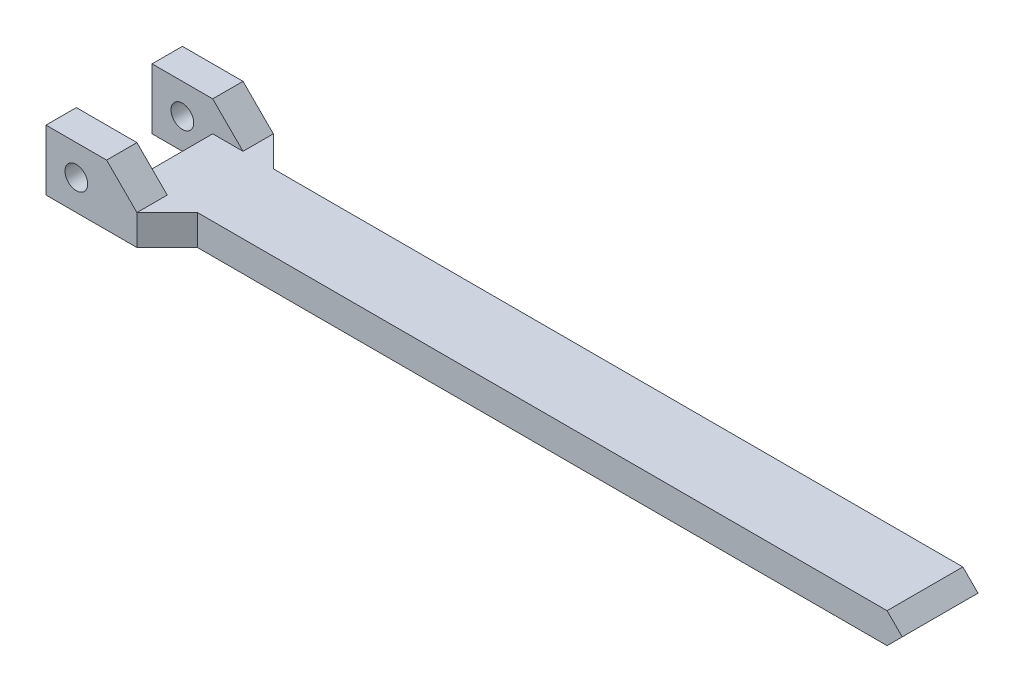
ISO-10303-21;
HEADER;
FILE_DESCRIPTION(('STEP AP214'),'2;1');
FILE_NAME('part.step','',(''),(''),'','','');
FILE_SCHEMA(('AUTOMOTIVE_DESIGN { 1 0 10303 214 1 1 1 1 }'));
ENDSEC;
DATA;
#1=APPLICATION_CONTEXT('core data for automotive mechanical design processes');
#2=APPLICATION_PROTOCOL_DEFINITION('international standard','automotive_design',2000,#1);
#3=PRODUCT_CONTEXT('',#1,'mechanical');
#4=PRODUCT('Part','Part','',(#3));
#5=PRODUCT_RELATED_PRODUCT_CATEGORY('part','',(#4));
#6=PRODUCT_DEFINITION_FORMATION('','',#4);
#7=PRODUCT_DEFINITION_CONTEXT('part definition',#1,'design');
#8=PRODUCT_DEFINITION('design','',#6,#7);
#9=PRODUCT_DEFINITION_SHAPE('','',#8);
#10=(LENGTH_UNIT() NAMED_UNIT(*) SI_UNIT(.MILLI.,.METRE.));
#11=(NAMED_UNIT(*) PLANE_ANGLE_UNIT() SI_UNIT($,.RADIAN.));
#12=(NAMED_UNIT(*) SI_UNIT($,.STERADIAN.) SOLID_ANGLE_UNIT());
#13=UNCERTAINTY_MEASURE_WITH_UNIT(LENGTH_MEASURE(1.E-05),#10,'distance_accuracy_value','');
#14=(GEOMETRIC_REPRESENTATION_CONTEXT(3) GLOBAL_UNCERTAINTY_ASSIGNED_CONTEXT((#13)) GLOBAL_UNIT_ASSIGNED_CONTEXT((#10,
#11,#12)) REPRESENTATION_CONTEXT('',''));
#15=CARTESIAN_POINT('',(0.,0.,0.));
#16=DIRECTION('',(0.,0.,1.));
#17=DIRECTION('',(1.,0.,0.));
#18=AXIS2_PLACEMENT_3D('',#15,#16,#17);
#19=CARTESIAN_POINT('',(-50.5,4.,-5.));
#20=DIRECTION('',(0.,0.,1.));
#21=DIRECTION('',(1.,0.,0.));
#22=AXIS2_PLACEMENT_3D('',#19,#20,#21);
#23=PLANE('',#22);
#24=DIRECTION('',(-1.,0.,0.));
#25=VECTOR('',#24,1.);
#26=CARTESIAN_POINT('',(-50.5,4.,-5.));
#27=LINE('',#26,#25);
#28=CARTESIAN_POINT('',(48.5,4.,-5.));
#29=VERTEX_POINT('',#28);
#30=CARTESIAN_POINT('',(-42.5,4.,-5.));
#31=VERTEX_POINT('',#30);
#32=EDGE_CURVE('E242',#29,#31,#27,.T.);
#33=ORIENTED_EDGE('',*,*,#32,.F.);
#34=DIRECTION('',(-0.707106781186545,0.70710678118655,0.));
#35=VECTOR('',#34,1.);
#36=CARTESIAN_POINT('',(48.5,4.,-5.));
#37=LINE('',#36,#35);
#38=CARTESIAN_POINT('',(50.5,2.,-5.));
#39=VERTEX_POINT('',#38);
#40=EDGE_CURVE('E330',#29,#39,#37,.F.);
#41=ORIENTED_EDGE('',*,*,#40,.T.);
#42=DIRECTION('',(-0.70710678118655,-0.707106781186545,0.));
#43=VECTOR('',#42,1.);
#44=CARTESIAN_POINT('',(50.5,2.,-5.));
#45=LINE('',#44,#43);
#46=CARTESIAN_POINT('',(48.5,0.,-5.));
#47=VERTEX_POINT('',#46);
#48=EDGE_CURVE('E327',#39,#47,#45,.T.);
#49=ORIENTED_EDGE('',*,*,#48,.T.);
#50=DIRECTION('',(-1.,0.,0.));
#51=VECTOR('',#50,1.);
#52=CARTESIAN_POINT('',(-50.5,0.,-5.));
#53=LINE('',#52,#51);
#54=CARTESIAN_POINT('',(-42.5,0.,-5.));
#55=VERTEX_POINT('',#54);
#56=EDGE_CURVE('E233',#47,#55,#53,.T.);
#57=ORIENTED_EDGE('',*,*,#56,.T.);
#58=DIRECTION('',(0.,1.,0.));
#59=VECTOR('',#58,1.);
#60=CARTESIAN_POINT('',(-42.5,4.,-5.));
#61=LINE('',#60,#59);
#62=EDGE_CURVE('E289',#55,#31,#61,.T.);
#63=ORIENTED_EDGE('',*,*,#62,.T.);
#64=EDGE_LOOP('',(#33,#41,#49,#57,#63));
#65=FACE_BOUND('',#64,.T.);
#66=ADVANCED_FACE('F41',(#65),#23,.F.);
#67=CARTESIAN_POINT('',(-50.5,4.,5.));
#68=DIRECTION('',(1.,0.,0.));
#69=DIRECTION('',(0.,0.,-1.));
#70=AXIS2_PLACEMENT_3D('',#67,#68,#69);
#71=PLANE('',#70);
#72=DIRECTION('',(0.,0.,1.));
#73=VECTOR('',#72,1.);
#74=CARTESIAN_POINT('',(-50.5,0.,5.));
#75=LINE('',#74,#73);
#76=CARTESIAN_POINT('',(-50.5,0.,-5.));
#77=VERTEX_POINT('',#76);
#78=CARTESIAN_POINT('',(-50.5,0.,5.));
#79=VERTEX_POINT('',#78);
#80=EDGE_CURVE('E258',#77,#79,#75,.T.);
#81=ORIENTED_EDGE('',*,*,#80,.T.);
#82=DIRECTION('',(0.,-1.,0.));
#83=VECTOR('',#82,1.);
#84=CARTESIAN_POINT('',(-50.5,4.,5.));
#85=LINE('',#84,#83);
#86=CARTESIAN_POINT('',(-50.5,4.,5.));
#87=VERTEX_POINT('',#86);
#88=EDGE_CURVE('E255',#87,#79,#85,.T.);
#89=ORIENTED_EDGE('',*,*,#88,.F.);
#90=DIRECTION('',(0.,0.,1.));
#91=VECTOR('',#90,1.);
#92=CARTESIAN_POINT('',(-50.5,4.,5.));
#93=LINE('',#92,#91);
#94=CARTESIAN_POINT('',(-50.5,4.,-5.));
#95=VERTEX_POINT('',#94);
#96=EDGE_CURVE('E245',#95,#87,#93,.T.);
#97=ORIENTED_EDGE('',*,*,#96,.F.);
#98=DIRECTION('',(0.,-1.,0.));
#99=VECTOR('',#98,1.);
#100=CARTESIAN_POINT('',(-50.5,4.,-5.));
#101=LINE('',#100,#99);
#102=EDGE_CURVE('E267',#95,#77,#101,.T.);
#103=ORIENTED_EDGE('',*,*,#102,.T.);
#104=EDGE_LOOP('',(#81,#89,#97,#103));
#105=FACE_BOUND('',#104,.T.);
#106=ADVANCED_FACE('F380',(#105),#71,.F.);
#107=CARTESIAN_POINT('',(-50.5,4.,5.));
#108=DIRECTION('',(0.,0.,-1.));
#109=DIRECTION('',(-1.,0.,0.));
#110=AXIS2_PLACEMENT_3D('',#107,#108,#109);
#111=PLANE('',#110);
#112=DIRECTION('',(0.70710678118655,0.707106781186545,0.));
#113=VECTOR('',#112,1.);
#114=CARTESIAN_POINT('',(50.5,2.,5.));
#115=LINE('',#114,#113);
#116=CARTESIAN_POINT('',(48.5,0.,5.));
#117=VERTEX_POINT('',#116);
#118=CARTESIAN_POINT('',(50.5,2.,5.));
#119=VERTEX_POINT('',#118);
#120=EDGE_CURVE('E59',#117,#119,#115,.T.);
#121=ORIENTED_EDGE('',*,*,#120,.T.);
#122=DIRECTION('',(0.707106781186545,-0.70710678118655,0.));
#123=VECTOR('',#122,1.);
#124=CARTESIAN_POINT('',(48.5,4.,5.));
#125=LINE('',#124,#123);
#126=CARTESIAN_POINT('',(48.5,4.,5.));
#127=VERTEX_POINT('',#126);
#128=EDGE_CURVE('E52',#119,#127,#125,.F.);
#129=ORIENTED_EDGE('',*,*,#128,.T.);
#130=DIRECTION('',(1.,0.,0.));
#131=VECTOR('',#130,1.);
#132=CARTESIAN_POINT('',(-50.5,4.,5.));
#133=LINE('',#132,#131);
#134=CARTESIAN_POINT('',(-42.5,4.,5.));
#135=VERTEX_POINT('',#134);
#136=EDGE_CURVE('E250',#135,#127,#133,.T.);
#137=ORIENTED_EDGE('',*,*,#136,.F.);
#138=DIRECTION('',(0.,-1.,0.));
#139=VECTOR('',#138,1.);
#140=CARTESIAN_POINT('',(-42.5,0.,5.));
#141=LINE('',#140,#139);
#142=CARTESIAN_POINT('',(-42.5,0.,5.));
#143=VERTEX_POINT('',#142);
#144=EDGE_CURVE('E293',#135,#143,#141,.T.);
#145=ORIENTED_EDGE('',*,*,#144,.T.);
#146=DIRECTION('',(1.,0.,0.));
#147=VECTOR('',#146,1.);
#148=CARTESIAN_POINT('',(-50.5,0.,5.));
#149=LINE('',#148,#147);
#150=EDGE_CURVE('E262',#143,#117,#149,.T.);
#151=ORIENTED_EDGE('',*,*,#150,.T.);
#152=EDGE_LOOP('',(#121,#129,#137,#145,#151));
#153=FACE_BOUND('',#152,.T.);
#154=ADVANCED_FACE('F339',(#153),#111,.F.);
#155=CARTESIAN_POINT('',(0.,4.,0.));
#156=DIRECTION('',(0.,-1.,0.));
#157=DIRECTION('',(0.,0.,-1.));
#158=AXIS2_PLACEMENT_3D('',#155,#156,#157);
#159=PLANE('',#158);
#160=ORIENTED_EDGE('',*,*,#136,.T.);
#161=DIRECTION('',(0.,0.,-1.));
#162=VECTOR('',#161,1.);
#163=CARTESIAN_POINT('',(48.5,4.,0.));
#164=LINE('',#163,#162);
#165=EDGE_CURVE('E318',#127,#29,#164,.T.);
#166=ORIENTED_EDGE('',*,*,#165,.T.);
#167=ORIENTED_EDGE('',*,*,#32,.T.);
#168=DIRECTION('',(-0.707106781186551,0.,-0.707106781186544));
#169=VECTOR('',#168,1.);
#170=CARTESIAN_POINT('',(-18.7499999999998,4.,18.75));
#171=LINE('',#170,#169);
#172=CARTESIAN_POINT('',(-46.5,3.99999999999998,-9.));
#173=VERTEX_POINT('',#172);
#174=EDGE_CURVE('E297',#31,#173,#171,.T.);
#175=ORIENTED_EDGE('',*,*,#174,.T.);
#176=DIRECTION('',(0.,0.,1.));
#177=VECTOR('',#176,1.);
#178=CARTESIAN_POINT('',(-46.5,4.,-9.));
#179=LINE('',#178,#177);
#180=CARTESIAN_POINT('',(-46.5,4.,-5.));
#181=VERTEX_POINT('',#180);
#182=EDGE_CURVE('E311',#181,#173,#179,.F.);
#183=ORIENTED_EDGE('',*,*,#182,.F.);
#184=EDGE_CURVE('E246',#181,#95,#27,.T.);
#185=ORIENTED_EDGE('',*,*,#184,.T.);
#186=ORIENTED_EDGE('',*,*,#96,.T.);
#187=CARTESIAN_POINT('',(-46.5,4.,5.));
#188=VERTEX_POINT('',#187);
#189=EDGE_CURVE('E251',#87,#188,#133,.T.);
#190=ORIENTED_EDGE('',*,*,#189,.T.);
#191=DIRECTION('',(0.,0.,1.));
#192=VECTOR('',#191,1.);
#193=CARTESIAN_POINT('',(-46.5,4.,0.));
#194=LINE('',#193,#192);
#195=CARTESIAN_POINT('',(-46.5,4.,8.99999999999998));
#196=VERTEX_POINT('',#195);
#197=EDGE_CURVE('E315',#188,#196,#194,.T.);
#198=ORIENTED_EDGE('',*,*,#197,.T.);
#199=DIRECTION('',(-0.707106781186551,0.,0.707106781186544));
#200=VECTOR('',#199,1.);
#201=CARTESIAN_POINT('',(-18.7499999999998,4.,-18.75));
#202=LINE('',#201,#200);
#203=EDGE_CURVE('E308',#196,#135,#202,.F.);
#204=ORIENTED_EDGE('',*,*,#203,.T.);
#205=EDGE_LOOP('',(#160,#166,#167,#175,#183,#185,#186,#190,#198,#204));
#206=FACE_BOUND('',#205,.T.);
#207=ADVANCED_FACE('F345',(#206),#159,.F.);
#208=CARTESIAN_POINT('',(0.,0.,0.));
#209=DIRECTION('',(0.,-1.,0.));
#210=DIRECTION('',(0.,0.,-1.));
#211=AXIS2_PLACEMENT_3D('',#208,#209,#210);
#212=PLANE('',#211);
#213=ORIENTED_EDGE('',*,*,#56,.F.);
#214=DIRECTION('',(0.,0.,1.));
#215=VECTOR('',#214,1.);
#216=CARTESIAN_POINT('',(48.5,0.,5.));
#217=LINE('',#216,#215);
#218=EDGE_CURVE('E11',#47,#117,#217,.T.);
#219=ORIENTED_EDGE('',*,*,#218,.T.);
#220=ORIENTED_EDGE('',*,*,#150,.F.);
#221=DIRECTION('',(0.707106781186551,0.,-0.707106781186544));
#222=VECTOR('',#221,1.);
#223=CARTESIAN_POINT('',(-42.5,0.,5.));
#224=LINE('',#223,#222);
#225=CARTESIAN_POINT('',(-46.5,0.,9.));
#226=VERTEX_POINT('',#225);
#227=EDGE_CURVE('E305',#143,#226,#224,.F.);
#228=ORIENTED_EDGE('',*,*,#227,.T.);
#229=DIRECTION('',(-1.,0.,0.));
#230=VECTOR('',#229,1.);
#231=CARTESIAN_POINT('',(-46.5,0.,9.));
#232=LINE('',#231,#230);
#233=CARTESIAN_POINT('',(-58.5,0.,9.));
#234=VERTEX_POINT('',#233);
#235=EDGE_CURVE('E206',#226,#234,#232,.T.);
#236=ORIENTED_EDGE('',*,*,#235,.T.);
#237=DIRECTION('',(0.,0.,1.));
#238=VECTOR('',#237,1.);
#239=CARTESIAN_POINT('',(-58.5,0.,5.));
#240=LINE('',#239,#238);
#241=CARTESIAN_POINT('',(-58.5,0.,5.));
#242=VERTEX_POINT('',#241);
#243=EDGE_CURVE('E180',#242,#234,#240,.T.);
#244=ORIENTED_EDGE('',*,*,#243,.F.);
#245=DIRECTION('',(-1.,0.,0.));
#246=VECTOR('',#245,1.);
#247=CARTESIAN_POINT('',(-46.5,0.,5.));
#248=LINE('',#247,#246);
#249=EDGE_CURVE('E169',#79,#242,#248,.T.);
#250=ORIENTED_EDGE('',*,*,#249,.F.);
#251=ORIENTED_EDGE('',*,*,#80,.F.);
#252=DIRECTION('',(-1.,0.,0.));
#253=VECTOR('',#252,1.);
#254=CARTESIAN_POINT('',(-46.5,0.,-5.));
#255=LINE('',#254,#253);
#256=CARTESIAN_POINT('',(-58.5,0.,-5.));
#257=VERTEX_POINT('',#256);
#258=EDGE_CURVE('E237',#77,#257,#255,.T.);
#259=ORIENTED_EDGE('',*,*,#258,.T.);
#260=DIRECTION('',(0.,0.,1.));
#261=VECTOR('',#260,1.);
#262=CARTESIAN_POINT('',(-58.5,0.,-9.));
#263=LINE('',#262,#261);
#264=CARTESIAN_POINT('',(-58.5,0.,-9.));
#265=VERTEX_POINT('',#264);
#266=EDGE_CURVE('E214',#265,#257,#263,.T.);
#267=ORIENTED_EDGE('',*,*,#266,.F.);
#268=DIRECTION('',(-1.,0.,0.));
#269=VECTOR('',#268,1.);
#270=CARTESIAN_POINT('',(-46.5,0.,-9.));
#271=LINE('',#270,#269);
#272=CARTESIAN_POINT('',(-46.5,0.,-9.));
#273=VERTEX_POINT('',#272);
#274=EDGE_CURVE('E229',#273,#265,#271,.T.);
#275=ORIENTED_EDGE('',*,*,#274,.F.);
#276=DIRECTION('',(0.707106781186551,0.,0.707106781186544));
#277=VECTOR('',#276,1.);
#278=CARTESIAN_POINT('',(-42.5,0.,-5.));
#279=LINE('',#278,#277);
#280=EDGE_CURVE('E301',#273,#55,#279,.T.);
#281=ORIENTED_EDGE('',*,*,#280,.T.);
#282=EDGE_LOOP('',(#213,#219,#220,#228,#236,#244,#250,#251,#259,#267,#275,#281));
#283=FACE_BOUND('',#282,.T.);
#284=ADVANCED_FACE('F444',(#283),#212,.T.);
#285=CARTESIAN_POINT('',(-46.5,0.,-5.));
#286=DIRECTION('',(0.,0.,1.));
#287=DIRECTION('',(1.,0.,0.));
#288=AXIS2_PLACEMENT_3D('',#285,#286,#287);
#289=PLANE('',#288);
#290=CARTESIAN_POINT('',(-54.5,4.,-5.));
#291=DIRECTION('',(0.,0.,1.));
#292=DIRECTION('',(1.,0.,0.));
#293=AXIS2_PLACEMENT_3D('',#290,#291,#292);
#294=CIRCLE('',#293,1.5);
#295=CARTESIAN_POINT('',(-53.,4.,-5.));
#296=VERTEX_POINT('',#295);
#297=EDGE_CURVE('E187',#296,#296,#294,.T.);
#298=ORIENTED_EDGE('',*,*,#297,.F.);
#299=EDGE_LOOP('',(#298));
#300=FACE_BOUND('',#299,.T.);
#301=ORIENTED_EDGE('',*,*,#184,.F.);
#302=DIRECTION('',(0.707106781186546,-0.707106781186549,0.));
#303=VECTOR('',#302,1.);
#304=CARTESIAN_POINT('',(-44.5,1.99999999999998,-5.));
#305=LINE('',#304,#303);
#306=CARTESIAN_POINT('',(-50.5,8.,-5.));
#307=VERTEX_POINT('',#306);
#308=EDGE_CURVE('E278',#181,#307,#305,.F.);
#309=ORIENTED_EDGE('',*,*,#308,.T.);
#310=DIRECTION('',(-1.,0.,0.));
#311=VECTOR('',#310,1.);
#312=CARTESIAN_POINT('',(-46.5,8.,-5.));
#313=LINE('',#312,#311);
#314=CARTESIAN_POINT('',(-58.5,8.,-5.));
#315=VERTEX_POINT('',#314);
#316=EDGE_CURVE('E234',#307,#315,#313,.T.);
#317=ORIENTED_EDGE('',*,*,#316,.T.);
#318=DIRECTION('',(0.,1.,0.));
#319=VECTOR('',#318,1.);
#320=CARTESIAN_POINT('',(-58.5,0.,-5.));
#321=LINE('',#320,#319);
#322=EDGE_CURVE('E218',#257,#315,#321,.T.);
#323=ORIENTED_EDGE('',*,*,#322,.F.);
#324=ORIENTED_EDGE('',*,*,#258,.F.);
#325=ORIENTED_EDGE('',*,*,#102,.F.);
#326=EDGE_LOOP('',(#301,#309,#317,#323,#324,#325));
#327=FACE_BOUND('',#326,.T.);
#328=ADVANCED_FACE('F451',(#300,#327),#289,.T.);
#329=CARTESIAN_POINT('',(-46.5,0.,-9.));
#330=DIRECTION('',(0.,0.,-1.));
#331=DIRECTION('',(-1.,0.,0.));
#332=AXIS2_PLACEMENT_3D('',#329,#330,#331);
#333=PLANE('',#332);
#334=CARTESIAN_POINT('',(-54.5,4.,-9.));
#335=DIRECTION('',(0.,0.,1.));
#336=DIRECTION('',(1.,0.,0.));
#337=AXIS2_PLACEMENT_3D('',#334,#335,#336);
#338=CIRCLE('',#337,1.5);
#339=CARTESIAN_POINT('',(-53.,4.,-9.));
#340=VERTEX_POINT('',#339);
#341=EDGE_CURVE('E323',#340,#340,#338,.T.);
#342=ORIENTED_EDGE('',*,*,#341,.T.);
#343=EDGE_LOOP('',(#342));
#344=FACE_BOUND('',#343,.T.);
#345=DIRECTION('',(-1.,0.,0.));
#346=VECTOR('',#345,1.);
#347=CARTESIAN_POINT('',(-46.5,8.,-9.));
#348=LINE('',#347,#346);
#349=CARTESIAN_POINT('',(-50.5,8.,-9.));
#350=VERTEX_POINT('',#349);
#351=CARTESIAN_POINT('',(-58.5,8.,-9.));
#352=VERTEX_POINT('',#351);
#353=EDGE_CURVE('E230',#350,#352,#348,.T.);
#354=ORIENTED_EDGE('',*,*,#353,.F.);
#355=DIRECTION('',(-0.707106781186546,0.707106781186549,0.));
#356=VECTOR('',#355,1.);
#357=CARTESIAN_POINT('',(-44.5,1.99999999999998,-9.));
#358=LINE('',#357,#356);
#359=EDGE_CURVE('E275',#350,#173,#358,.F.);
#360=ORIENTED_EDGE('',*,*,#359,.T.);
#361=DIRECTION('',(0.,-1.,0.));
#362=VECTOR('',#361,1.);
#363=CARTESIAN_POINT('',(-46.5,0.,-9.));
#364=LINE('',#363,#362);
#365=EDGE_CURVE('E226',#173,#273,#364,.T.);
#366=ORIENTED_EDGE('',*,*,#365,.T.);
#367=ORIENTED_EDGE('',*,*,#274,.T.);
#368=DIRECTION('',(0.,-1.,0.));
#369=VECTOR('',#368,1.);
#370=CARTESIAN_POINT('',(-58.5,0.,-9.));
#371=LINE('',#370,#369);
#372=EDGE_CURVE('E205',#352,#265,#371,.T.);
#373=ORIENTED_EDGE('',*,*,#372,.F.);
#374=EDGE_LOOP('',(#354,#360,#366,#367,#373));
#375=FACE_BOUND('',#374,.T.);
#376=ADVANCED_FACE('F463',(#344,#375),#333,.T.);
#377=CARTESIAN_POINT('',(-46.5,8.,-9.));
#378=DIRECTION('',(0.,1.,0.));
#379=DIRECTION('',(0.,0.,1.));
#380=AXIS2_PLACEMENT_3D('',#377,#378,#379);
#381=PLANE('',#380);
#382=ORIENTED_EDGE('',*,*,#316,.F.);
#383=DIRECTION('',(0.,0.,-1.));
#384=VECTOR('',#383,1.);
#385=CARTESIAN_POINT('',(-50.5,8.,-9.));
#386=LINE('',#385,#384);
#387=EDGE_CURVE('E271',#307,#350,#386,.T.);
#388=ORIENTED_EDGE('',*,*,#387,.T.);
#389=ORIENTED_EDGE('',*,*,#353,.T.);
#390=DIRECTION('',(0.,0.,-1.));
#391=VECTOR('',#390,1.);
#392=CARTESIAN_POINT('',(-58.5,8.,-9.));
#393=LINE('',#392,#391);
#394=EDGE_CURVE('E222',#315,#352,#393,.T.);
#395=ORIENTED_EDGE('',*,*,#394,.F.);
#396=EDGE_LOOP('',(#382,#388,#389,#395));
#397=FACE_BOUND('',#396,.T.);
#398=ADVANCED_FACE('F375',(#397),#381,.T.);
#399=CARTESIAN_POINT('',(-58.5,0.,0.));
#400=DIRECTION('',(1.,0.,0.));
#401=DIRECTION('',(0.,0.,-1.));
#402=AXIS2_PLACEMENT_3D('',#399,#400,#401);
#403=PLANE('',#402);
#404=ORIENTED_EDGE('',*,*,#372,.T.);
#405=ORIENTED_EDGE('',*,*,#266,.T.);
#406=ORIENTED_EDGE('',*,*,#322,.T.);
#407=ORIENTED_EDGE('',*,*,#394,.T.);
#408=EDGE_LOOP('',(#404,#405,#406,#407));
#409=FACE_BOUND('',#408,.T.);
#410=ADVANCED_FACE('F367',(#409),#403,.F.);
#411=CARTESIAN_POINT('',(-46.5,0.,5.));
#412=DIRECTION('',(0.,0.,-1.));
#413=DIRECTION('',(0.,1.,0.));
#414=AXIS2_PLACEMENT_3D('',#411,#412,#413);
#415=PLANE('',#414);
#416=CARTESIAN_POINT('',(-54.5,4.,5.));
#417=DIRECTION('',(0.,0.,-1.));
#418=DIRECTION('',(0.,1.,0.));
#419=AXIS2_PLACEMENT_3D('',#416,#417,#418);
#420=CIRCLE('',#419,1.5);
#421=CARTESIAN_POINT('',(-54.5,5.5,5.));
#422=VERTEX_POINT('',#421);
#423=EDGE_CURVE('E191',#422,#422,#420,.T.);
#424=ORIENTED_EDGE('',*,*,#423,.F.);
#425=EDGE_LOOP('',(#424));
#426=FACE_BOUND('',#425,.T.);
#427=DIRECTION('',(-1.,0.,0.));
#428=VECTOR('',#427,1.);
#429=CARTESIAN_POINT('',(-46.5,8.,5.));
#430=LINE('',#429,#428);
#431=CARTESIAN_POINT('',(-50.5,8.,5.));
#432=VERTEX_POINT('',#431);
#433=CARTESIAN_POINT('',(-58.5,8.,5.));
#434=VERTEX_POINT('',#433);
#435=EDGE_CURVE('E158',#432,#434,#430,.T.);
#436=ORIENTED_EDGE('',*,*,#435,.F.);
#437=DIRECTION('',(0.707106781186546,-0.707106781186549,0.));
#438=VECTOR('',#437,1.);
#439=CARTESIAN_POINT('',(-44.5,1.99999999999998,5.));
#440=LINE('',#439,#438);
#441=EDGE_CURVE('E283',#432,#188,#440,.T.);
#442=ORIENTED_EDGE('',*,*,#441,.T.);
#443=ORIENTED_EDGE('',*,*,#189,.F.);
#444=ORIENTED_EDGE('',*,*,#88,.T.);
#445=ORIENTED_EDGE('',*,*,#249,.T.);
#446=DIRECTION('',(0.,-1.,0.));
#447=VECTOR('',#446,1.);
#448=CARTESIAN_POINT('',(-58.5,0.,5.));
#449=LINE('',#448,#447);
#450=EDGE_CURVE('E173',#434,#242,#449,.T.);
#451=ORIENTED_EDGE('',*,*,#450,.F.);
#452=EDGE_LOOP('',(#436,#442,#443,#444,#445,#451));
#453=FACE_BOUND('',#452,.T.);
#454=ADVANCED_FACE('F174',(#426,#453),#415,.T.);
#455=CARTESIAN_POINT('',(-46.5,8.,5.));
#456=DIRECTION('',(0.,1.,0.));
#457=DIRECTION('',(0.,0.,1.));
#458=AXIS2_PLACEMENT_3D('',#455,#456,#457);
#459=PLANE('',#458);
#460=DIRECTION('',(-1.,0.,0.));
#461=VECTOR('',#460,1.);
#462=CARTESIAN_POINT('',(-46.5,8.,9.));
#463=LINE('',#462,#461);
#464=CARTESIAN_POINT('',(-50.5,8.,9.));
#465=VERTEX_POINT('',#464);
#466=CARTESIAN_POINT('',(-58.5,8.,9.));
#467=VERTEX_POINT('',#466);
#468=EDGE_CURVE('E202',#465,#467,#463,.T.);
#469=ORIENTED_EDGE('',*,*,#468,.F.);
#470=DIRECTION('',(0.,0.,-1.));
#471=VECTOR('',#470,1.);
#472=CARTESIAN_POINT('',(-50.5,8.,5.));
#473=LINE('',#472,#471);
#474=EDGE_CURVE('E165',#465,#432,#473,.T.);
#475=ORIENTED_EDGE('',*,*,#474,.T.);
#476=ORIENTED_EDGE('',*,*,#435,.T.);
#477=DIRECTION('',(0.,0.,-1.));
#478=VECTOR('',#477,1.);
#479=CARTESIAN_POINT('',(-58.5,8.,5.));
#480=LINE('',#479,#478);
#481=EDGE_CURVE('E163',#467,#434,#480,.T.);
#482=ORIENTED_EDGE('',*,*,#481,.F.);
#483=EDGE_LOOP('',(#469,#475,#476,#482));
#484=FACE_BOUND('',#483,.T.);
#485=ADVANCED_FACE('F161',(#484),#459,.T.);
#486=CARTESIAN_POINT('',(-46.5,0.,9.));
#487=DIRECTION('',(0.,0.,1.));
#488=DIRECTION('',(1.,0.,0.));
#489=AXIS2_PLACEMENT_3D('',#486,#487,#488);
#490=PLANE('',#489);
#491=CARTESIAN_POINT('',(-54.5,4.,9.));
#492=DIRECTION('',(0.,0.,1.));
#493=DIRECTION('',(1.,0.,0.));
#494=AXIS2_PLACEMENT_3D('',#491,#492,#493);
#495=CIRCLE('',#494,1.5);
#496=CARTESIAN_POINT('',(-53.,4.,9.));
#497=VERTEX_POINT('',#496);
#498=EDGE_CURVE('E319',#497,#497,#495,.T.);
#499=ORIENTED_EDGE('',*,*,#498,.F.);
#500=EDGE_LOOP('',(#499));
#501=FACE_BOUND('',#500,.T.);
#502=DIRECTION('',(0.,1.,0.));
#503=VECTOR('',#502,1.);
#504=CARTESIAN_POINT('',(-46.5,0.,9.));
#505=LINE('',#504,#503);
#506=EDGE_CURVE('E170',#226,#196,#505,.T.);
#507=ORIENTED_EDGE('',*,*,#506,.T.);
#508=DIRECTION('',(-0.707106781186546,0.707106781186549,0.));
#509=VECTOR('',#508,1.);
#510=CARTESIAN_POINT('',(-44.5,1.99999999999998,9.));
#511=LINE('',#510,#509);
#512=EDGE_CURVE('E286',#196,#465,#511,.T.);
#513=ORIENTED_EDGE('',*,*,#512,.T.);
#514=ORIENTED_EDGE('',*,*,#468,.T.);
#515=DIRECTION('',(0.,1.,0.));
#516=VECTOR('',#515,1.);
#517=CARTESIAN_POINT('',(-58.5,0.,9.));
#518=LINE('',#517,#516);
#519=EDGE_CURVE('E185',#234,#467,#518,.T.);
#520=ORIENTED_EDGE('',*,*,#519,.F.);
#521=ORIENTED_EDGE('',*,*,#235,.F.);
#522=EDGE_LOOP('',(#507,#513,#514,#520,#521));
#523=FACE_BOUND('',#522,.T.);
#524=ADVANCED_FACE('F373',(#501,#523),#490,.T.);
#525=CARTESIAN_POINT('',(-58.5,0.,0.));
#526=DIRECTION('',(-1.,0.,0.));
#527=DIRECTION('',(0.,0.,1.));
#528=AXIS2_PLACEMENT_3D('',#525,#526,#527);
#529=PLANE('',#528);
#530=ORIENTED_EDGE('',*,*,#481,.T.);
#531=ORIENTED_EDGE('',*,*,#450,.T.);
#532=ORIENTED_EDGE('',*,*,#243,.T.);
#533=ORIENTED_EDGE('',*,*,#519,.T.);
#534=EDGE_LOOP('',(#530,#531,#532,#533));
#535=FACE_BOUND('',#534,.T.);
#536=ADVANCED_FACE('F183',(#535),#529,.T.);
#537=CARTESIAN_POINT('',(-50.5,8.,-9.));
#538=DIRECTION('',(-0.707106781186549,-0.707106781186546,0.));
#539=DIRECTION('',(0.,0.,-1.));
#540=AXIS2_PLACEMENT_3D('',#537,#538,#539);
#541=PLANE('',#540);
#542=ORIENTED_EDGE('',*,*,#308,.F.);
#543=ORIENTED_EDGE('',*,*,#182,.T.);
#544=ORIENTED_EDGE('',*,*,#359,.F.);
#545=ORIENTED_EDGE('',*,*,#387,.F.);
#546=EDGE_LOOP('',(#542,#543,#544,#545));
#547=FACE_BOUND('',#546,.T.);
#548=ADVANCED_FACE('F390',(#547),#541,.F.);
#549=CARTESIAN_POINT('',(-50.5,8.,5.));
#550=DIRECTION('',(0.707106781186549,0.707106781186546,0.));
#551=DIRECTION('',(0.,0.,1.));
#552=AXIS2_PLACEMENT_3D('',#549,#550,#551);
#553=PLANE('',#552);
#554=ORIENTED_EDGE('',*,*,#512,.F.);
#555=ORIENTED_EDGE('',*,*,#197,.F.);
#556=ORIENTED_EDGE('',*,*,#441,.F.);
#557=ORIENTED_EDGE('',*,*,#474,.F.);
#558=EDGE_LOOP('',(#554,#555,#556,#557));
#559=FACE_BOUND('',#558,.T.);
#560=ADVANCED_FACE('F396',(#559),#553,.T.);
#561=CARTESIAN_POINT('',(-42.5,4.,-5.));
#562=DIRECTION('',(-0.707106781186544,0.,0.707106781186551));
#563=DIRECTION('',(0.,1.,0.));
#564=AXIS2_PLACEMENT_3D('',#561,#562,#563);
#565=PLANE('',#564);
#566=ORIENTED_EDGE('',*,*,#280,.F.);
#567=ORIENTED_EDGE('',*,*,#365,.F.);
#568=ORIENTED_EDGE('',*,*,#174,.F.);
#569=ORIENTED_EDGE('',*,*,#62,.F.);
#570=EDGE_LOOP('',(#566,#567,#568,#569));
#571=FACE_BOUND('',#570,.T.);
#572=ADVANCED_FACE('F403',(#571),#565,.F.);
#573=CARTESIAN_POINT('',(-42.5,4.,5.));
#574=DIRECTION('',(0.707106781186544,0.,0.707106781186551));
#575=DIRECTION('',(0.,1.,0.));
#576=AXIS2_PLACEMENT_3D('',#573,#574,#575);
#577=PLANE('',#576);
#578=ORIENTED_EDGE('',*,*,#203,.F.);
#579=ORIENTED_EDGE('',*,*,#506,.F.);
#580=ORIENTED_EDGE('',*,*,#227,.F.);
#581=ORIENTED_EDGE('',*,*,#144,.F.);
#582=EDGE_LOOP('',(#578,#579,#580,#581));
#583=FACE_BOUND('',#582,.T.);
#584=ADVANCED_FACE('F410',(#583),#577,.T.);
#585=CARTESIAN_POINT('',(-54.5,4.,-9.));
#586=DIRECTION('',(0.,0.,1.));
#587=DIRECTION('',(1.,0.,0.));
#588=AXIS2_PLACEMENT_3D('',#585,#586,#587);
#589=CYLINDRICAL_SURFACE('',#588,1.5);
#590=ORIENTED_EDGE('',*,*,#423,.T.);
#591=EDGE_LOOP('',(#590));
#592=FACE_BOUND('',#591,.T.);
#593=ORIENTED_EDGE('',*,*,#498,.T.);
#594=EDGE_LOOP('',(#593));
#595=FACE_BOUND('',#594,.T.);
#596=ADVANCED_FACE('F363',(#592,#595),#589,.F.);
#597=ORIENTED_EDGE('',*,*,#297,.T.);
#598=EDGE_LOOP('',(#597));
#599=FACE_BOUND('',#598,.T.);
#600=ORIENTED_EDGE('',*,*,#341,.F.);
#601=EDGE_LOOP('',(#600));
#602=FACE_BOUND('',#601,.T.);
#603=ADVANCED_FACE('F423',(#599,#602),#589,.F.);
#604=CARTESIAN_POINT('',(50.5,2.,5.));
#605=DIRECTION('',(0.707106781186545,-0.70710678118655,0.));
#606=DIRECTION('',(0.,0.,1.));
#607=AXIS2_PLACEMENT_3D('',#604,#605,#606);
#608=PLANE('',#607);
#609=DIRECTION('',(0.,0.,-1.));
#610=VECTOR('',#609,1.);
#611=CARTESIAN_POINT('',(50.5,2.,-5.));
#612=LINE('',#611,#610);
#613=EDGE_CURVE('E46',#119,#39,#612,.T.);
#614=ORIENTED_EDGE('',*,*,#613,.F.);
#615=ORIENTED_EDGE('',*,*,#120,.F.);
#616=ORIENTED_EDGE('',*,*,#218,.F.);
#617=ORIENTED_EDGE('',*,*,#48,.F.);
#618=EDGE_LOOP('',(#614,#615,#616,#617));
#619=FACE_BOUND('',#618,.T.);
#620=ADVANCED_FACE('F44',(#619),#608,.T.);
#621=CARTESIAN_POINT('',(48.5,4.,0.));
#622=DIRECTION('',(-0.70710678118655,-0.707106781186545,0.));
#623=DIRECTION('',(0.,0.,-1.));
#624=AXIS2_PLACEMENT_3D('',#621,#622,#623);
#625=PLANE('',#624);
#626=ORIENTED_EDGE('',*,*,#128,.F.);
#627=ORIENTED_EDGE('',*,*,#613,.T.);
#628=ORIENTED_EDGE('',*,*,#40,.F.);
#629=ORIENTED_EDGE('',*,*,#165,.F.);
#630=EDGE_LOOP('',(#626,#627,#628,#629));
#631=FACE_BOUND('',#630,.T.);
#632=ADVANCED_FACE('F349',(#631),#625,.F.);
#633=CLOSED_SHELL('',(#66,#106,#154,#207,#284,#328,#376,#398,#410,#454,#485,#524,#536,#548,#560,
#572,#584,#596,#603,#620,#632));
#634=MANIFOLD_SOLID_BREP('B2',#633);
#635=ADVANCED_BREP_SHAPE_REPRESENTATION('',(#18,#634),#14);
#636=SHAPE_DEFINITION_REPRESENTATION(#9,#635);
ENDSEC;
END-ISO-10303-21;
